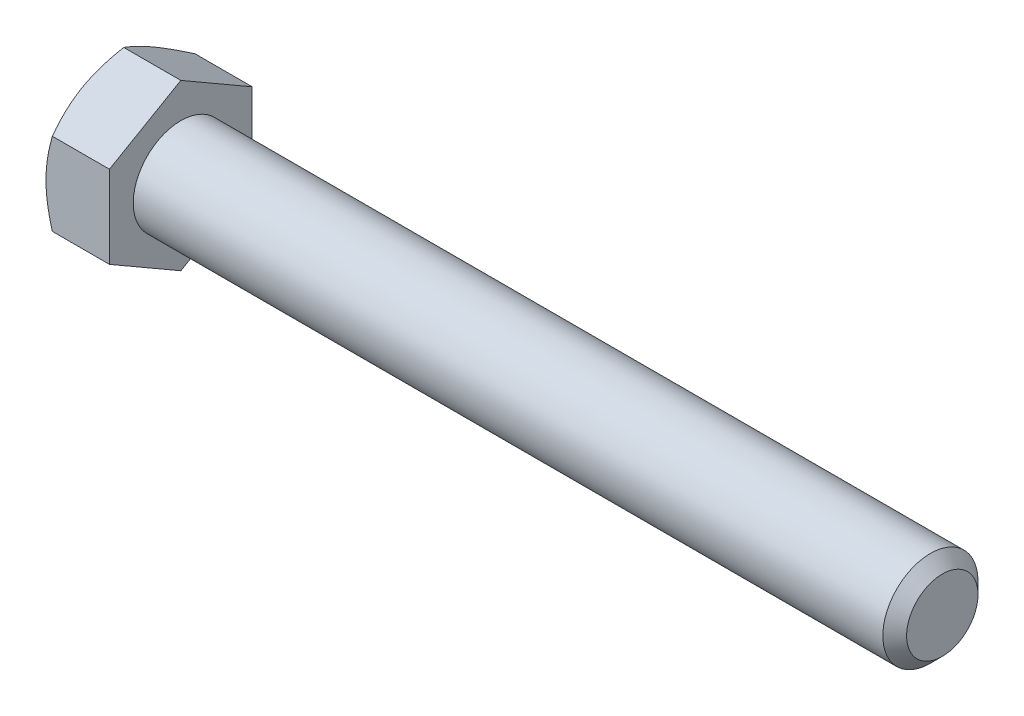
ISO-10303-21;
HEADER;
FILE_DESCRIPTION(('STEP AP214'),'2;1');
FILE_NAME('part.step','',(''),(''),'','','');
FILE_SCHEMA(('AUTOMOTIVE_DESIGN { 1 0 10303 214 1 1 1 1 }'));
ENDSEC;
DATA;
#1=APPLICATION_CONTEXT('core data for automotive mechanical design processes');
#2=APPLICATION_PROTOCOL_DEFINITION('international standard','automotive_design',2000,#1);
#3=PRODUCT_CONTEXT('',#1,'mechanical');
#4=PRODUCT('Part','Part','',(#3));
#5=PRODUCT_RELATED_PRODUCT_CATEGORY('part','',(#4));
#6=PRODUCT_DEFINITION_FORMATION('','',#4);
#7=PRODUCT_DEFINITION_CONTEXT('part definition',#1,'design');
#8=PRODUCT_DEFINITION('design','',#6,#7);
#9=PRODUCT_DEFINITION_SHAPE('','',#8);
#10=(LENGTH_UNIT() NAMED_UNIT(*) SI_UNIT(.MILLI.,.METRE.));
#11=(NAMED_UNIT(*) PLANE_ANGLE_UNIT() SI_UNIT($,.RADIAN.));
#12=(NAMED_UNIT(*) SI_UNIT($,.STERADIAN.) SOLID_ANGLE_UNIT());
#13=UNCERTAINTY_MEASURE_WITH_UNIT(LENGTH_MEASURE(1.E-05),#10,'distance_accuracy_value','');
#14=(GEOMETRIC_REPRESENTATION_CONTEXT(3) GLOBAL_UNCERTAINTY_ASSIGNED_CONTEXT((#13)) GLOBAL_UNIT_ASSIGNED_CONTEXT((#10,
#11,#12)) REPRESENTATION_CONTEXT('',''));
#15=CARTESIAN_POINT('',(0.,0.,0.));
#16=DIRECTION('',(0.,0.,1.));
#17=DIRECTION('',(1.,0.,0.));
#18=AXIS2_PLACEMENT_3D('',#15,#16,#17);
#19=CARTESIAN_POINT('',(-41.275,-4.12444598552339,7.14375));
#20=DIRECTION('',(0.,0.,-1.));
#21=DIRECTION('',(0.,1.,0.));
#22=AXIS2_PLACEMENT_3D('',#19,#20,#21);
#23=PLANE('',#22);
#24=CARTESIAN_POINT('',(-37.6837107291246,-11.2944476437763,7.14375000000001));
#25=CARTESIAN_POINT('',(-37.8368470181609,-10.9805232394077,7.14375000000001));
#26=CARTESIAN_POINT('',(-37.9885759416199,-10.6659008872169,7.14375000000001));
#27=CARTESIAN_POINT('',(-38.2884314864202,-10.0348898213436,7.14375000000001));
#28=CARTESIAN_POINT('',(-38.4365575792035,-9.71850085675994,7.14375000000001));
#29=CARTESIAN_POINT('',(-38.7291194579079,-9.08205743380556,7.14375000000001));
#30=CARTESIAN_POINT('',(-38.8735325502159,-8.76199250898872,7.14375000000001));
#31=CARTESIAN_POINT('',(-39.156729056574,-8.1193909617974,7.14375000000001));
#32=CARTESIAN_POINT('',(-39.2955127230965,-7.79685445104335,7.14375));
#33=CARTESIAN_POINT('',(-39.5706162676198,-7.13766604016633,7.14375));
#34=CARTESIAN_POINT('',(-39.706687685096,-6.80090989506933,7.14375));
#35=CARTESIAN_POINT('',(-39.9690446569592,-6.12353919008608,7.14375));
#36=CARTESIAN_POINT('',(-40.0953291440824,-5.78292421402389,7.14375));
#37=CARTESIAN_POINT('',(-40.3349543305284,-5.09786024749812,7.14375));
#38=CARTESIAN_POINT('',(-40.448319456363,-4.75341989048741,7.14375));
#39=CARTESIAN_POINT('',(-40.6586129161924,-4.05961513378647,7.14375));
#40=CARTESIAN_POINT('',(-40.7555462033468,-3.71025225244227,7.14375));
#41=CARTESIAN_POINT('',(-40.9279472656941,-3.00829070513183,7.14375));
#42=CARTESIAN_POINT('',(-41.0035368409942,-2.65572276057783,7.14375));
#43=CARTESIAN_POINT('',(-41.0977473017322,-2.12349462014205,7.14375));
#44=CARTESIAN_POINT('',(-41.1259563298876,-1.94551103747566,7.14375));
#45=CARTESIAN_POINT('',(-41.1754356720994,-1.58858869612631,7.14375));
#46=CARTESIAN_POINT('',(-41.1967066947931,-1.40965003689206,7.14375));
#47=CARTESIAN_POINT('',(-41.2316079167657,-1.05348730697548,7.14375));
#48=CARTESIAN_POINT('',(-41.2453382749067,-0.876273093939468,7.14375));
#49=CARTESIAN_POINT('',(-41.2652847155611,-0.521422092230765,7.14375));
#50=CARTESIAN_POINT('',(-41.2715009289899,-0.343785310974302,7.14375));
#51=CARTESIAN_POINT('',(-41.2762697532719,0.0115936241286041,7.14375));
#52=CARTESIAN_POINT('',(-41.2748223313712,0.18933577842216,7.14375));
#53=CARTESIAN_POINT('',(-41.2643014350504,0.544596189800663,7.14375));
#54=CARTESIAN_POINT('',(-41.2552276208028,0.722114436555401,7.14375));
#55=CARTESIAN_POINT('',(-41.2249195257372,1.14231672690702,7.14375));
#56=CARTESIAN_POINT('',(-41.2004249010896,1.38477115845963,7.14375));
#57=CARTESIAN_POINT('',(-41.1384979515929,1.86800860977947,7.14375));
#58=CARTESIAN_POINT('',(-41.1010640485552,2.1087914220052,7.14375));
#59=CARTESIAN_POINT('',(-40.9713280647363,2.82827840353934,7.14375));
#60=CARTESIAN_POINT('',(-40.8616106087773,3.30389106689052,7.14375));
#61=CARTESIAN_POINT('',(-40.6696836999771,4.01550298491582,7.14375));
#62=CARTESIAN_POINT('',(-40.6001876580378,4.2551445486297,7.14375));
#63=CARTESIAN_POINT('',(-40.4535636125596,4.73210450573968,7.14375));
#64=CARTESIAN_POINT('',(-40.3764355486346,4.96942288073788,7.14375));
#65=CARTESIAN_POINT('',(-40.2158189394422,5.44180614696491,7.14375));
#66=CARTESIAN_POINT('',(-40.1323321060842,5.67687162566704,7.14375));
#67=CARTESIAN_POINT('',(-39.9600214111274,6.14502503891485,7.14375));
#68=CARTESIAN_POINT('',(-39.8711976818887,6.37811302234082,7.14375));
#69=CARTESIAN_POINT('',(-39.620948189305,7.01633974983142,7.14375));
#70=CARTESIAN_POINT('',(-39.4549401417684,7.41968025406996,7.14375));
#71=CARTESIAN_POINT('',(-39.1128746766817,8.22209357946087,7.14375));
#72=CARTESIAN_POINT('',(-38.9368160495413,8.62116588004216,7.14375));
#73=CARTESIAN_POINT('',(-38.5770756305015,9.41604681837602,7.14375));
#74=CARTESIAN_POINT('',(-38.39339071307,9.81185403670852,7.14375));
#75=CARTESIAN_POINT('',(-38.0202597306568,10.600712317216,7.14375));
#76=CARTESIAN_POINT('',(-37.8308139221842,10.9937635011499,7.14375));
#77=CARTESIAN_POINT('',(-37.4471131080566,11.7783335003943,7.14375));
#78=CARTESIAN_POINT('',(-37.2528504856735,12.1698485826142,7.14375));
#79=CARTESIAN_POINT('',(-36.8607727676525,12.9510972653694,7.14375));
#80=CARTESIAN_POINT('',(-36.6629576395818,13.3408308495995,7.14375));
#81=CARTESIAN_POINT('',(-36.2645317877312,14.1187472681695,7.14375));
#82=CARTESIAN_POINT('',(-36.06392174218,14.5069304503015,7.14375));
#83=CARTESIAN_POINT('',(-35.6603913196838,15.2820948012496,7.14375));
#84=CARTESIAN_POINT('',(-35.4574709333829,15.6690759651901,7.14375));
#85=CARTESIAN_POINT('',(-34.8903473303459,16.7442233759679,7.14375));
#86=CARTESIAN_POINT('',(-34.5240917630888,17.4313067825052,7.14375));
#87=CARTESIAN_POINT('',(-33.787235673475,18.8031936251545,7.14375));
#88=CARTESIAN_POINT('',(-33.4166348627093,19.4879969060088,7.14375));
#89=CARTESIAN_POINT('',(-32.6735201430137,20.8534506388627,7.14375));
#90=CARTESIAN_POINT('',(-32.3010175066124,21.5341072316457,7.14374999999999));
#91=CARTESIAN_POINT('',(-31.5535551210306,22.8939962458748,7.14374999999999));
#92=CARTESIAN_POINT('',(-31.1785955803167,23.5732287818577,7.14374999999999));
#93=CARTESIAN_POINT('',(-30.802745898524,24.2519647910624,7.14374999999999));
#94=B_SPLINE_CURVE_WITH_KNOTS('',3,(#24,#25,#26,#27,#28,#29,#30,#31,#32,#33,#34,#35,#36,#37,#38,
#39,#40,#41,#42,#43,#44,#45,#46,#47,#48,#49,#50,#51,#52,#53,#54,#55,#56,#57,#58,#59,#60,#61,#62,
#63,#64,#65,#66,#67,#68,#69,#70,#71,#72,#73,#74,#75,#76,#77,#78,#79,#80,#81,#82,#83,#84,#85,#86,
#87,#88,#89,#90,#91,#92,#93),.UNSPECIFIED.,.F.,.F.,(4,2,2,2,2,2,2,2,2,2,2,2,2,2,2,2,2,2,2,2,2,2,
2,2,2,2,2,2,2,2,2,2,2,2,4),(0.,1.04786354483491,2.0958799018221,3.14924522983534,
4.20256326345294,5.29206939195641,6.38169416429139,7.46922336086985,8.55642415101154,
9.63728918942532,10.1777908946976,10.7182373766564,11.2513201674657,11.7843936705003,
12.3174694518642,12.8505689880335,13.5812265935341,14.3119733479507,15.7741561909275,
16.522632821703,17.2711153750577,18.0193971292228,18.7676603329377,20.0759569450815,
21.3844113444431,22.6934073945101,24.002345245369,25.3135047056319,26.6246761423151,
27.9355347616116,29.2463986911018,31.5821913644605,33.9181399602315,36.245893663836,
38.573452352829),.UNSPECIFIED.);
#95=CARTESIAN_POINT('',(-40.6369459855234,-4.12444598552339,7.14375));
#96=VERTEX_POINT('',#95);
#97=CARTESIAN_POINT('',(-41.275,0.,7.14375));
#98=VERTEX_POINT('',#97);
#99=EDGE_CURVE('E255',#96,#98,#94,.T.);
#100=ORIENTED_EDGE('',*,*,#99,.F.);
#101=DIRECTION('',(1.,0.,0.));
#102=VECTOR('',#101,1.);
#103=CARTESIAN_POINT('',(-41.275,-4.12444598552339,7.14375));
#104=LINE('',#103,#102);
#105=CARTESIAN_POINT('',(-34.925,-4.12444598552339,7.14375));
#106=VERTEX_POINT('',#105);
#107=EDGE_CURVE('E238',#96,#106,#104,.T.);
#108=ORIENTED_EDGE('',*,*,#107,.T.);
#109=DIRECTION('',(0.,1.,0.));
#110=VECTOR('',#109,1.);
#111=CARTESIAN_POINT('',(-34.925,-4.12444598552339,7.14375));
#112=LINE('',#111,#110);
#113=CARTESIAN_POINT('',(-34.925,4.12444598552339,7.14375));
#114=VERTEX_POINT('',#113);
#115=EDGE_CURVE('E253',#106,#114,#112,.T.);
#116=ORIENTED_EDGE('',*,*,#115,.T.);
#117=DIRECTION('',(1.,0.,0.));
#118=VECTOR('',#117,1.);
#119=CARTESIAN_POINT('',(-41.275,4.12444598552339,7.14375));
#120=LINE('',#119,#118);
#121=CARTESIAN_POINT('',(-40.6369459855234,4.12444598552339,7.14375));
#122=VERTEX_POINT('',#121);
#123=EDGE_CURVE('E229',#122,#114,#120,.T.);
#124=ORIENTED_EDGE('',*,*,#123,.F.);
#125=EDGE_CURVE('E109',#98,#122,#94,.T.);
#126=ORIENTED_EDGE('',*,*,#125,.F.);
#127=EDGE_LOOP('',(#100,#108,#116,#124,#126));
#128=FACE_BOUND('',#127,.T.);
#129=ADVANCED_FACE('F33',(#128),#23,.F.);
#130=CARTESIAN_POINT('',(-41.275,4.12444598552339,7.14375));
#131=DIRECTION('',(0.,-0.866025403784439,-0.5));
#132=DIRECTION('',(0.,0.5,-0.866025403784439));
#133=AXIS2_PLACEMENT_3D('',#130,#131,#132);
#134=PLANE('',#133);
#135=CARTESIAN_POINT('',(-40.6368793174569,4.12433051546955,7.14395));
#136=CARTESIAN_POINT('',(-40.68921396855,4.21499047493765,6.98692234398911));
#137=CARTESIAN_POINT('',(-40.7391734741408,4.30598845856222,6.82930921296504));
#138=CARTESIAN_POINT('',(-40.8336880324684,4.48872342670424,6.51280296382358));
#139=CARTESIAN_POINT('',(-40.8782407537979,4.58046071195489,6.35390932482102));
#140=CARTESIAN_POINT('',(-41.0029142378888,4.85714139103217,5.87468433118651));
#141=CARTESIAN_POINT('',(-41.0738270900442,5.04317693592539,5.55246131541769));
#142=CARTESIAN_POINT('',(-41.1569807614031,5.32157574305278,5.07026043670648));
#143=CARTESIAN_POINT('',(-41.1806688344435,5.4131071832703,4.91172333175978));
#144=CARTESIAN_POINT('',(-41.2203902768645,5.59658364372469,4.59393278025988));
#145=CARTESIAN_POINT('',(-41.2364243225755,5.6885286266948,4.43467939825459));
#146=CARTESIAN_POINT('',(-41.260429077991,5.87257827929426,4.11589604883692));
#147=CARTESIAN_POINT('',(-41.2684089385863,5.96468264833057,3.95636660206697));
#148=CARTESIAN_POINT('',(-41.2761427757077,6.14897138013525,3.63716915531883));
#149=CARTESIAN_POINT('',(-41.2758970063572,6.24115574034438,3.47750115977337));
#150=CARTESIAN_POINT('',(-41.2639170896088,6.49371006632156,3.04006423550959));
#151=CARTESIAN_POINT('',(-41.243806378855,6.65399735752975,2.76243850332942));
#152=CARTESIAN_POINT('',(-41.180035493257,6.97350732659354,2.20903100338617));
#153=CARTESIAN_POINT('',(-41.1363535225342,7.13272888080875,1.93325118182535));
#154=CARTESIAN_POINT('',(-41.0271614095432,7.45288184700059,1.37872997818721));
#155=CARTESIAN_POINT('',(-40.9611886381118,7.61377286233254,1.10005856515092));
#156=CARTESIAN_POINT('',(-40.8114571178419,7.93315557291967,0.546871483354954));
#157=CARTESIAN_POINT('',(-40.7277335396244,8.09165135831552,0.272348730263808));
#158=CARTESIAN_POINT('',(-40.6368793174569,8.24900744110062,-0.00020000000000243));
#159=B_SPLINE_CURVE_WITH_KNOTS('',3,(#135,#136,#137,#138,#139,#140,#141,#142,#143,#144,#145,
#146,#147,#148,#149,#150,#151,#152,#153,#154,#155,#156,#157,#158),.UNSPECIFIED.,.F.,.F.,(4,2,2,
2,2,2,2,2,2,2,2,4),(0.,0.566119481838008,1.13248221371019,2.26756105798161,2.82119915823018,
3.37478832846408,3.92774781910559,4.48069022658465,5.44329448766885,6.4067903790172,
7.39165514483024,8.37458648302854),.UNSPECIFIED.);
#160=CARTESIAN_POINT('',(-41.275,6.18666897828508,3.571875));
#161=VERTEX_POINT('',#160);
#162=EDGE_CURVE('E105',#122,#161,#159,.T.);
#163=ORIENTED_EDGE('',*,*,#162,.F.);
#164=ORIENTED_EDGE('',*,*,#123,.T.);
#165=DIRECTION('',(0.,0.5,-0.866025403784439));
#166=VECTOR('',#165,1.);
#167=CARTESIAN_POINT('',(-34.925,4.12444598552339,7.14375));
#168=LINE('',#167,#166);
#169=CARTESIAN_POINT('',(-34.925,8.24889197104678,0.));
#170=VERTEX_POINT('',#169);
#171=EDGE_CURVE('E252',#114,#170,#168,.T.);
#172=ORIENTED_EDGE('',*,*,#171,.T.);
#173=DIRECTION('',(1.,0.,0.));
#174=VECTOR('',#173,1.);
#175=CARTESIAN_POINT('',(-41.275,8.24889197104678,0.));
#176=LINE('',#175,#174);
#177=CARTESIAN_POINT('',(-40.6369459855234,8.24889197104678,0.));
#178=VERTEX_POINT('',#177);
#179=EDGE_CURVE('E128',#178,#170,#176,.T.);
#180=ORIENTED_EDGE('',*,*,#179,.F.);
#181=EDGE_CURVE('E113',#161,#178,#159,.T.);
#182=ORIENTED_EDGE('',*,*,#181,.F.);
#183=EDGE_LOOP('',(#163,#164,#172,#180,#182));
#184=FACE_BOUND('',#183,.T.);
#185=ADVANCED_FACE('F126',(#184),#134,.F.);
#186=CARTESIAN_POINT('',(-41.275,8.24889197104678,0.));
#187=DIRECTION('',(0.,-0.866025403784439,0.5));
#188=DIRECTION('',(0.,-0.5,-0.866025403784439));
#189=AXIS2_PLACEMENT_3D('',#186,#187,#188);
#190=PLANE('',#189);
#191=CARTESIAN_POINT('',(-40.6368793174569,8.24900744110062,0.000199999999998423));
#192=CARTESIAN_POINT('',(-40.68921396855,8.15834748163251,-0.156827656010894));
#193=CARTESIAN_POINT('',(-40.7391734741408,8.06734949800795,-0.314440787034966));
#194=CARTESIAN_POINT('',(-40.8336880324684,7.88461452986593,-0.630947036176425));
#195=CARTESIAN_POINT('',(-40.8782407537979,7.79287724461528,-0.789840675178983));
#196=CARTESIAN_POINT('',(-41.0029142378888,7.516196565538,-1.26906566881349));
#197=CARTESIAN_POINT('',(-41.0738270900442,7.33016102064478,-1.59128868458231));
#198=CARTESIAN_POINT('',(-41.1569807614031,7.05176221351739,-2.07348956329352));
#199=CARTESIAN_POINT('',(-41.1806688344435,6.96023077329986,-2.23202666824022));
#200=CARTESIAN_POINT('',(-41.2203902768645,6.77675431284548,-2.54981721974012));
#201=CARTESIAN_POINT('',(-41.2364243225755,6.68480932987537,-2.70907060174541));
#202=CARTESIAN_POINT('',(-41.260429077991,6.50075967727591,-3.02785395116308));
#203=CARTESIAN_POINT('',(-41.2684089385863,6.4086553082396,-3.18738339793304));
#204=CARTESIAN_POINT('',(-41.2761427757077,6.22436657643492,-3.50658084468118));
#205=CARTESIAN_POINT('',(-41.2758970063572,6.13218221622578,-3.66624884022663));
#206=CARTESIAN_POINT('',(-41.2639170896088,5.87962789024861,-4.10368576449041));
#207=CARTESIAN_POINT('',(-41.2438063788549,5.71934059904042,-4.38131149667058));
#208=CARTESIAN_POINT('',(-41.180035493257,5.39983062997663,-4.93471899661383));
#209=CARTESIAN_POINT('',(-41.1363535225342,5.24060907576142,-5.21049881817465));
#210=CARTESIAN_POINT('',(-41.0271614095432,4.92045610956959,-5.76502002181279));
#211=CARTESIAN_POINT('',(-40.9611886381118,4.75956509423763,-6.04369143484908));
#212=CARTESIAN_POINT('',(-40.8114571178419,4.44018238365051,-6.59687851664505));
#213=CARTESIAN_POINT('',(-40.7277335396243,4.28168659825466,-6.87140126973619));
#214=CARTESIAN_POINT('',(-40.6368793174569,4.12433051546956,-7.14395));
#215=B_SPLINE_CURVE_WITH_KNOTS('',3,(#191,#192,#193,#194,#195,#196,#197,#198,#199,#200,#201,
#202,#203,#204,#205,#206,#207,#208,#209,#210,#211,#212,#213,#214),.UNSPECIFIED.,.F.,.F.,(4,2,2,
2,2,2,2,2,2,2,2,4),(0.,0.566119481838006,1.13248221371019,2.2675610579816,2.82119915823018,
3.37478832846408,3.92774781910559,4.48069022658465,5.44329448766885,6.4067903790172,
7.39165514483023,8.37458648302854),.UNSPECIFIED.);
#216=CARTESIAN_POINT('',(-41.275,6.18666897828508,-3.571875));
#217=VERTEX_POINT('',#216);
#218=EDGE_CURVE('E118',#178,#217,#215,.T.);
#219=ORIENTED_EDGE('',*,*,#218,.F.);
#220=ORIENTED_EDGE('',*,*,#179,.T.);
#221=DIRECTION('',(0.,-0.5,-0.866025403784439));
#222=VECTOR('',#221,1.);
#223=CARTESIAN_POINT('',(-34.925,8.24889197104678,0.));
#224=LINE('',#223,#222);
#225=CARTESIAN_POINT('',(-34.925,4.12444598552339,-7.14375));
#226=VERTEX_POINT('',#225);
#227=EDGE_CURVE('E249',#170,#226,#224,.T.);
#228=ORIENTED_EDGE('',*,*,#227,.T.);
#229=DIRECTION('',(1.,0.,0.));
#230=VECTOR('',#229,1.);
#231=CARTESIAN_POINT('',(-41.275,4.12444598552339,-7.14375));
#232=LINE('',#231,#230);
#233=CARTESIAN_POINT('',(-40.6369459855234,4.12444598552339,-7.14375));
#234=VERTEX_POINT('',#233);
#235=EDGE_CURVE('E232',#234,#226,#232,.T.);
#236=ORIENTED_EDGE('',*,*,#235,.F.);
#237=EDGE_CURVE('E129',#217,#234,#215,.T.);
#238=ORIENTED_EDGE('',*,*,#237,.F.);
#239=EDGE_LOOP('',(#219,#220,#228,#236,#238));
#240=FACE_BOUND('',#239,.T.);
#241=ADVANCED_FACE('F189',(#240),#190,.F.);
#242=CARTESIAN_POINT('',(-41.275,4.12444598552339,-7.14375));
#243=DIRECTION('',(0.,0.,1.));
#244=DIRECTION('',(0.,-1.,0.));
#245=AXIS2_PLACEMENT_3D('',#242,#243,#244);
#246=PLANE('',#245);
#247=CARTESIAN_POINT('',(-37.683710735141,-11.2944476314463,-7.14375));
#248=CARTESIAN_POINT('',(-37.8368470239269,-10.980523227493,-7.14375));
#249=CARTESIAN_POINT('',(-37.9885759471357,-10.6659008757179,-7.14375));
#250=CARTESIAN_POINT('',(-38.2884314914368,-10.0348898106771,-7.14375));
#251=CARTESIAN_POINT('',(-38.436557583971,-9.71850084651029,-7.14375));
#252=CARTESIAN_POINT('',(-38.7291194621773,-9.08205742439585,-7.14375));
#253=CARTESIAN_POINT('',(-38.8735325542362,-8.7619925000021,-7.14375));
#254=CARTESIAN_POINT('',(-39.1567290601003,-8.11939095365976,-7.14375));
#255=CARTESIAN_POINT('',(-39.2955127263778,-7.7968544433316,-7.14375));
#256=CARTESIAN_POINT('',(-39.5706162704032,-7.13766603334091,-7.14375));
#257=CARTESIAN_POINT('',(-39.7066876876271,-6.80090988870464,-7.14375));
#258=CARTESIAN_POINT('',(-39.9690446589987,-6.12353918465013,-7.14375));
#259=CARTESIAN_POINT('',(-40.0953291458829,-5.78292420905595,-7.14375));
#260=CARTESIAN_POINT('',(-40.3349543318731,-5.09786024347484,-7.14375));
#261=CARTESIAN_POINT('',(-40.448319457491,-4.75341988694075,-7.14375));
#262=CARTESIAN_POINT('',(-40.6586129169216,-4.05961513120583,-7.14375));
#263=CARTESIAN_POINT('',(-40.755546203894,-3.71025225035102,-7.14375));
#264=CARTESIAN_POINT('',(-40.9279472658733,-3.00829070426652,-7.14375));
#265=CARTESIAN_POINT('',(-41.0035368410009,-2.65572276045244,-7.14375));
#266=CARTESIAN_POINT('',(-41.0977473015633,-2.12349462113998,-7.14375));
#267=CARTESIAN_POINT('',(-41.1259563296739,-1.94551103885013,-7.14375));
#268=CARTESIAN_POINT('',(-41.1754356718271,-1.5885886982572,-7.14375));
#269=CARTESIAN_POINT('',(-41.1967066945069,-1.40965003940282,-7.14375));
#270=CARTESIAN_POINT('',(-41.2316079164856,-1.05348731023808,-7.14375));
#271=CARTESIAN_POINT('',(-41.2453382746457,-0.876273097573986,-7.14375));
#272=CARTESIAN_POINT('',(-41.2652847153717,-0.521422096608587,-7.14375));
#273=CARTESIAN_POINT('',(-41.2715009288527,-0.34378531572351,-7.14375));
#274=CARTESIAN_POINT('',(-41.2762697532717,0.0115936186392656,-7.14375));
#275=CARTESIAN_POINT('',(-41.2748223314557,0.189335772564077,-7.14375));
#276=CARTESIAN_POINT('',(-41.2643014353346,0.544596183209796,-7.14375));
#277=CARTESIAN_POINT('',(-41.255227621202,0.722114429600494,-7.14375));
#278=CARTESIAN_POINT('',(-41.224919526419,1.14231671939732,-7.14375));
#279=CARTESIAN_POINT('',(-41.2004249019336,1.3847711507607,-7.14375));
#280=CARTESIAN_POINT('',(-41.1384979527697,1.8680086017109,-7.14375));
#281=CARTESIAN_POINT('',(-41.1010640499027,2.1087914137562,-7.14375));
#282=CARTESIAN_POINT('',(-40.9713280665993,2.8282783947592,-7.14375));
#283=CARTESIAN_POINT('',(-40.8616106109884,3.30389105777069,-7.14375));
#284=CARTESIAN_POINT('',(-40.6696837027012,4.01550297528799,-7.14375));
#285=CARTESIAN_POINT('',(-40.6001876609342,4.25514453882878,-7.14375));
#286=CARTESIAN_POINT('',(-40.4535636157949,4.7321044955946,-7.14375));
#287=CARTESIAN_POINT('',(-40.3764355520365,4.96942287042174,-7.14375));
#288=CARTESIAN_POINT('',(-40.2158189431713,5.44180613630801,-7.14375));
#289=CARTESIAN_POINT('',(-40.1323321099739,5.67687161484044,-7.14375));
#290=CARTESIAN_POINT('',(-39.9600214153323,6.14502502774882,-7.14375));
#291=CARTESIAN_POINT('',(-39.8711976862483,6.37811301100507,-7.14375));
#292=CARTESIAN_POINT('',(-39.6209481939352,7.01633973840397,-7.14375));
#293=CARTESIAN_POINT('',(-39.4549401464965,7.41968024271512,-7.14375));
#294=CARTESIAN_POINT('',(-39.1128746815765,8.22209356824176,-7.14375));
#295=CARTESIAN_POINT('',(-38.9368160545049,8.62116586888615,-7.14375));
#296=CARTESIAN_POINT('',(-38.5770756355816,9.41604680733946,-7.14375));
#297=CARTESIAN_POINT('',(-38.3933907181979,9.81185402572831,-7.14375));
#298=CARTESIAN_POINT('',(-38.0202597358657,10.6007123063424,-7.14375));
#299=CARTESIAN_POINT('',(-37.8308139274263,10.9937634903265,-7.14375));
#300=CARTESIAN_POINT('',(-37.4471131133527,11.7783334896699,-7.14375));
#301=CARTESIAN_POINT('',(-37.2528504909905,12.1698485719387,-7.14375));
#302=CARTESIAN_POINT('',(-36.8607727730034,12.951097254788,-7.14375));
#303=CARTESIAN_POINT('',(-36.6629576449456,13.3408308390634,-7.14375));
#304=CARTESIAN_POINT('',(-36.2645317931152,14.1187472577206,-7.14375));
#305=CARTESIAN_POINT('',(-36.0639217475714,14.5069304398945,-7.14375));
#306=CARTESIAN_POINT('',(-35.6603913250851,15.2820947909242,-7.14375));
#307=CARTESIAN_POINT('',(-35.457470938787,15.6690759549044,-7.14375));
#308=CARTESIAN_POINT('',(-34.8903473357884,16.744223365723,-7.14375));
#309=CARTESIAN_POINT('',(-34.5240917685636,17.4313067722598,-7.14375));
#310=CARTESIAN_POINT('',(-33.787235679008,18.8031936149052,-7.14375));
#311=CARTESIAN_POINT('',(-33.4166348682681,19.487996895756,-7.14375));
#312=CARTESIAN_POINT('',(-32.673520148626,20.853450628589,-7.14375));
#313=CARTESIAN_POINT('',(-32.3010175122525,21.5341072213546,-7.14375));
#314=CARTESIAN_POINT('',(-31.5535551267233,22.8939962355469,-7.14375));
#315=CARTESIAN_POINT('',(-31.1785955860342,23.5732287715106,-7.14375));
#316=CARTESIAN_POINT('',(-30.8027459042655,24.2519647806954,-7.14375));
#317=B_SPLINE_CURVE_WITH_KNOTS('',3,(#247,#248,#249,#250,#251,#252,#253,#254,#255,#256,#257,
#258,#259,#260,#261,#262,#263,#264,#265,#266,#267,#268,#269,#270,#271,#272,#273,#274,#275,#276,
#277,#278,#279,#280,#281,#282,#283,#284,#285,#286,#287,#288,#289,#290,#291,#292,#293,#294,#295,
#296,#297,#298,#299,#300,#301,#302,#303,#304,#305,#306,#307,#308,#309,#310,#311,#312,#313,#314,
#315,#316),.UNSPECIFIED.,.F.,.F.,(4,2,2,2,2,2,2,2,2,2,2,2,2,2,2,2,2,2,2,2,2,2,2,2,2,2,2,2,2,2,2,
2,2,2,4),(0.,1.04786354338569,2.09587989892346,3.14924522547247,4.20256325762595,
5.2920693845644,6.38169415533385,7.46922335035172,8.55642413893401,9.63728917507435,
10.1777908792107,10.7182373600339,11.2513201497363,11.784393651664,12.3174694319207,
12.8505689669825,13.5812265718698,14.3119733256731,15.7741561674203,16.5226327975529,
17.2711153502647,18.0193971037887,18.7676603068624,20.0759569190947,21.3844113185457,
22.6934073687054,24.0023452196567,25.3135046800229,26.6246761168095,27.9355347362076,
29.2463986657995,31.5821913391112,33.9181399348361,36.2458936383548,38.573452327261),.UNSPECIFIED.);
#318=CARTESIAN_POINT('',(-41.275,0.,-7.14375));
#319=VERTEX_POINT('',#318);
#320=EDGE_CURVE('E183',#234,#319,#317,.F.);
#321=ORIENTED_EDGE('',*,*,#320,.F.);
#322=ORIENTED_EDGE('',*,*,#235,.T.);
#323=DIRECTION('',(0.,-1.,0.));
#324=VECTOR('',#323,1.);
#325=CARTESIAN_POINT('',(-34.925,4.12444598552339,-7.14375));
#326=LINE('',#325,#324);
#327=CARTESIAN_POINT('',(-34.925,-4.12444598552339,-7.14375));
#328=VERTEX_POINT('',#327);
#329=EDGE_CURVE('E246',#226,#328,#326,.T.);
#330=ORIENTED_EDGE('',*,*,#329,.T.);
#331=DIRECTION('',(1.,0.,0.));
#332=VECTOR('',#331,1.);
#333=CARTESIAN_POINT('',(-41.275,-4.12444598552339,-7.14375));
#334=LINE('',#333,#332);
#335=CARTESIAN_POINT('',(-40.6369459855234,-4.12444598552339,-7.14375));
#336=VERTEX_POINT('',#335);
#337=EDGE_CURVE('E234',#336,#328,#334,.T.);
#338=ORIENTED_EDGE('',*,*,#337,.F.);
#339=EDGE_CURVE('E177',#319,#336,#317,.F.);
#340=ORIENTED_EDGE('',*,*,#339,.F.);
#341=EDGE_LOOP('',(#321,#322,#330,#338,#340));
#342=FACE_BOUND('',#341,.T.);
#343=ADVANCED_FACE('F185',(#342),#246,.F.);
#344=CARTESIAN_POINT('',(-41.275,-4.12444598552339,-7.14375));
#345=DIRECTION('',(0.,0.866025403784439,0.5));
#346=DIRECTION('',(0.,-0.5,0.866025403784439));
#347=AXIS2_PLACEMENT_3D('',#344,#345,#346);
#348=PLANE('',#347);
#349=CARTESIAN_POINT('',(-40.6368793174569,-4.12433051546955,-7.14395));
#350=CARTESIAN_POINT('',(-40.68921396855,-4.21499047493766,-6.9869223439891));
#351=CARTESIAN_POINT('',(-40.7391734741408,-4.30598845856222,-6.82930921296503));
#352=CARTESIAN_POINT('',(-40.8336880324684,-4.48872342670424,-6.51280296382357));
#353=CARTESIAN_POINT('',(-40.8782407537979,-4.58046071195489,-6.35390932482101));
#354=CARTESIAN_POINT('',(-41.0029142378888,-4.85714139103217,-5.8746843311865));
#355=CARTESIAN_POINT('',(-41.0738270900442,-5.04317693592539,-5.55246131541769));
#356=CARTESIAN_POINT('',(-41.1569807614031,-5.32157574305278,-5.07026043670648));
#357=CARTESIAN_POINT('',(-41.1806688344435,-5.4131071832703,-4.91172333175978));
#358=CARTESIAN_POINT('',(-41.2203902768645,-5.59658364372469,-4.59393278025988));
#359=CARTESIAN_POINT('',(-41.2364243225755,-5.6885286266948,-4.43467939825459));
#360=CARTESIAN_POINT('',(-41.260429077991,-5.87257827929426,-4.11589604883692));
#361=CARTESIAN_POINT('',(-41.2684089385863,-5.96468264833057,-3.95636660206697));
#362=CARTESIAN_POINT('',(-41.2761427757077,-6.14897138013525,-3.63716915531883));
#363=CARTESIAN_POINT('',(-41.2758970063572,-6.24115574034438,-3.47750115977337));
#364=CARTESIAN_POINT('',(-41.2639170896088,-6.49371006632156,-3.04006423550959));
#365=CARTESIAN_POINT('',(-41.243806378855,-6.65399735752975,-2.76243850332942));
#366=CARTESIAN_POINT('',(-41.180035493257,-6.97350732659354,-2.20903100338617));
#367=CARTESIAN_POINT('',(-41.1363535225342,-7.13272888080875,-1.93325118182535));
#368=CARTESIAN_POINT('',(-41.0271614095432,-7.45288184700058,-1.37872997818721));
#369=CARTESIAN_POINT('',(-40.9611886381118,-7.61377286233254,-1.10005856515092));
#370=CARTESIAN_POINT('',(-40.8114571178419,-7.93315557291966,-0.546871483354957));
#371=CARTESIAN_POINT('',(-40.7277335396244,-8.09165135831551,-0.272348730263812));
#372=CARTESIAN_POINT('',(-40.6368793174569,-8.24900744110061,0.000200000000000276));
#373=B_SPLINE_CURVE_WITH_KNOTS('',3,(#349,#350,#351,#352,#353,#354,#355,#356,#357,#358,#359,
#360,#361,#362,#363,#364,#365,#366,#367,#368,#369,#370,#371,#372),.UNSPECIFIED.,.F.,.F.,(4,2,2,
2,2,2,2,2,2,2,2,4),(0.,0.566119481838005,1.13248221371019,2.2675610579816,2.82119915823017,
3.37478832846408,3.92774781910558,4.48069022658465,5.44329448766884,6.40679037901719,
7.39165514483023,8.37458648302853),.UNSPECIFIED.);
#374=CARTESIAN_POINT('',(-41.275,-6.18666897828508,-3.571875));
#375=VERTEX_POINT('',#374);
#376=EDGE_CURVE('E184',#336,#375,#373,.T.);
#377=ORIENTED_EDGE('',*,*,#376,.F.);
#378=ORIENTED_EDGE('',*,*,#337,.T.);
#379=DIRECTION('',(0.,-0.5,0.866025403784439));
#380=VECTOR('',#379,1.);
#381=CARTESIAN_POINT('',(-34.925,-4.12444598552339,-7.14375));
#382=LINE('',#381,#380);
#383=CARTESIAN_POINT('',(-34.925,-8.24889197104678,0.));
#384=VERTEX_POINT('',#383);
#385=EDGE_CURVE('E243',#328,#384,#382,.T.);
#386=ORIENTED_EDGE('',*,*,#385,.T.);
#387=DIRECTION('',(1.,0.,0.));
#388=VECTOR('',#387,1.);
#389=CARTESIAN_POINT('',(-41.275,-8.24889197104678,0.));
#390=LINE('',#389,#388);
#391=CARTESIAN_POINT('',(-40.6369459855234,-8.24889197104678,0.));
#392=VERTEX_POINT('',#391);
#393=EDGE_CURVE('E236',#392,#384,#390,.T.);
#394=ORIENTED_EDGE('',*,*,#393,.F.);
#395=EDGE_CURVE('E171',#375,#392,#373,.T.);
#396=ORIENTED_EDGE('',*,*,#395,.F.);
#397=EDGE_LOOP('',(#377,#378,#386,#394,#396));
#398=FACE_BOUND('',#397,.T.);
#399=ADVANCED_FACE('F188',(#398),#348,.F.);
#400=CARTESIAN_POINT('',(-41.275,-8.24889197104678,0.));
#401=DIRECTION('',(0.,0.866025403784439,-0.5));
#402=DIRECTION('',(0.,0.5,0.866025403784439));
#403=AXIS2_PLACEMENT_3D('',#400,#401,#402);
#404=PLANE('',#403);
#405=CARTESIAN_POINT('',(-40.6368793174569,-8.24900744110061,-0.000200000000000231));
#406=CARTESIAN_POINT('',(-40.68921396855,-8.15834748163251,0.156827656010892));
#407=CARTESIAN_POINT('',(-40.7391734741408,-8.06734949800794,0.314440787034964));
#408=CARTESIAN_POINT('',(-40.8336880324684,-7.88461452986592,0.630947036176423));
#409=CARTESIAN_POINT('',(-40.8782407537979,-7.79287724461528,0.789840675178982));
#410=CARTESIAN_POINT('',(-41.0029142378888,-7.51619656553799,1.26906566881349));
#411=CARTESIAN_POINT('',(-41.0738270900442,-7.33016102064478,1.59128868458231));
#412=CARTESIAN_POINT('',(-41.1569807614031,-7.05176221351738,2.07348956329352));
#413=CARTESIAN_POINT('',(-41.1806688344435,-6.96023077329986,2.23202666824022));
#414=CARTESIAN_POINT('',(-41.2203902768645,-6.77675431284548,2.54981721974012));
#415=CARTESIAN_POINT('',(-41.2364243225755,-6.68480932987537,2.7090706017454));
#416=CARTESIAN_POINT('',(-41.260429077991,-6.5007596772759,3.02785395116308));
#417=CARTESIAN_POINT('',(-41.2684089385863,-6.4086553082396,3.18738339793303));
#418=CARTESIAN_POINT('',(-41.2761427757077,-6.22436657643492,3.50658084468117));
#419=CARTESIAN_POINT('',(-41.2758970063572,-6.13218221622578,3.66624884022662));
#420=CARTESIAN_POINT('',(-41.2639170896088,-5.8796278902486,4.10368576449041));
#421=CARTESIAN_POINT('',(-41.243806378855,-5.71934059904042,4.38131149667058));
#422=CARTESIAN_POINT('',(-41.180035493257,-5.39983062997662,4.93471899661383));
#423=CARTESIAN_POINT('',(-41.1363535225342,-5.24060907576141,5.21049881817465));
#424=CARTESIAN_POINT('',(-41.0271614095432,-4.92045610956958,5.76502002181279));
#425=CARTESIAN_POINT('',(-40.9611886381118,-4.75956509423762,6.04369143484908));
#426=CARTESIAN_POINT('',(-40.8114571178419,-4.4401823836505,6.59687851664505));
#427=CARTESIAN_POINT('',(-40.7277335396244,-4.28168659825465,6.87140126973619));
#428=CARTESIAN_POINT('',(-40.6368793174569,-4.12433051546955,7.14395));
#429=B_SPLINE_CURVE_WITH_KNOTS('',3,(#405,#406,#407,#408,#409,#410,#411,#412,#413,#414,#415,
#416,#417,#418,#419,#420,#421,#422,#423,#424,#425,#426,#427,#428),.UNSPECIFIED.,.F.,.F.,(4,2,2,
2,2,2,2,2,2,2,2,4),(0.,0.566119481838004,1.13248221371019,2.2675610579816,2.82119915823017,
3.37478832846408,3.92774781910558,4.48069022658465,5.44329448766885,6.4067903790172,
7.39165514483024,8.37458648302854),.UNSPECIFIED.);
#430=CARTESIAN_POINT('',(-41.275,-6.18666897828508,3.571875));
#431=VERTEX_POINT('',#430);
#432=EDGE_CURVE('E281',#392,#431,#429,.T.);
#433=ORIENTED_EDGE('',*,*,#432,.F.);
#434=ORIENTED_EDGE('',*,*,#393,.T.);
#435=DIRECTION('',(0.,0.5,0.866025403784439));
#436=VECTOR('',#435,1.);
#437=CARTESIAN_POINT('',(-34.925,-8.24889197104678,0.));
#438=LINE('',#437,#436);
#439=EDGE_CURVE('E240',#384,#106,#438,.T.);
#440=ORIENTED_EDGE('',*,*,#439,.T.);
#441=ORIENTED_EDGE('',*,*,#107,.F.);
#442=EDGE_CURVE('E123',#431,#96,#429,.T.);
#443=ORIENTED_EDGE('',*,*,#442,.F.);
#444=EDGE_LOOP('',(#433,#434,#440,#441,#443));
#445=FACE_BOUND('',#444,.T.);
#446=ADVANCED_FACE('F210',(#445),#404,.F.);
#447=CARTESIAN_POINT('',(-34.925,0.,0.));
#448=DIRECTION('',(1.,0.,0.));
#449=DIRECTION('',(0.,0.,-1.));
#450=AXIS2_PLACEMENT_3D('',#447,#448,#449);
#451=CYLINDRICAL_SURFACE('',#450,4.7625);
#452=CARTESIAN_POINT('',(-34.925,0.,0.));
#453=DIRECTION('',(-1.,0.,0.));
#454=DIRECTION('',(0.,0.,1.));
#455=AXIS2_PLACEMENT_3D('',#452,#453,#454);
#456=CIRCLE('',#455,4.7625);
#457=CARTESIAN_POINT('',(-34.925,0.,4.7625));
#458=VERTEX_POINT('',#457);
#459=EDGE_CURVE('E219',#458,#458,#456,.F.);
#460=ORIENTED_EDGE('',*,*,#459,.T.);
#461=EDGE_LOOP('',(#460));
#462=FACE_BOUND('',#461,.T.);
#463=CARTESIAN_POINT('',(40.084375,0.,0.));
#464=DIRECTION('',(1.,0.,0.));
#465=DIRECTION('',(0.,0.,-1.));
#466=AXIS2_PLACEMENT_3D('',#463,#464,#465);
#467=CIRCLE('',#466,4.7625);
#468=CARTESIAN_POINT('',(40.084375,0.,-4.7625));
#469=VERTEX_POINT('',#468);
#470=EDGE_CURVE('E222',#469,#469,#467,.F.);
#471=ORIENTED_EDGE('',*,*,#470,.T.);
#472=EDGE_LOOP('',(#471));
#473=FACE_BOUND('',#472,.T.);
#474=ADVANCED_FACE('F207',(#462,#473),#451,.T.);
#475=CARTESIAN_POINT('',(41.275,0.,0.));
#476=DIRECTION('',(1.,0.,0.));
#477=DIRECTION('',(0.,0.,-1.));
#478=AXIS2_PLACEMENT_3D('',#475,#476,#477);
#479=PLANE('',#478);
#480=CARTESIAN_POINT('',(41.275,0.,0.));
#481=DIRECTION('',(1.,0.,0.));
#482=DIRECTION('',(0.,0.,-1.));
#483=AXIS2_PLACEMENT_3D('',#480,#481,#482);
#484=CIRCLE('',#483,3.571875);
#485=CARTESIAN_POINT('',(41.275,0.,-3.571875));
#486=VERTEX_POINT('',#485);
#487=EDGE_CURVE('E224',#486,#486,#484,.T.);
#488=ORIENTED_EDGE('',*,*,#487,.T.);
#489=EDGE_LOOP('',(#488));
#490=FACE_BOUND('',#489,.T.);
#491=ADVANCED_FACE('F205',(#490),#479,.T.);
#492=CARTESIAN_POINT('',(41.275,0.,0.));
#493=DIRECTION('',(-1.,0.,0.));
#494=DIRECTION('',(0.,0.,1.));
#495=AXIS2_PLACEMENT_3D('',#492,#493,#494);
#496=CONICAL_SURFACE('',#495,3.571875,0.78539816339745);
#497=ORIENTED_EDGE('',*,*,#470,.F.);
#498=EDGE_LOOP('',(#497));
#499=FACE_BOUND('',#498,.T.);
#500=ORIENTED_EDGE('',*,*,#487,.F.);
#501=EDGE_LOOP('',(#500));
#502=FACE_BOUND('',#501,.T.);
#503=ADVANCED_FACE('F35',(#499,#502),#496,.T.);
#504=CARTESIAN_POINT('',(-34.925,4.12444598552339,7.14375));
#505=DIRECTION('',(-1.,0.,0.));
#506=DIRECTION('',(0.,0.,1.));
#507=AXIS2_PLACEMENT_3D('',#504,#505,#506);
#508=PLANE('',#507);
#509=ORIENTED_EDGE('',*,*,#459,.F.);
#510=EDGE_LOOP('',(#509));
#511=FACE_BOUND('',#510,.T.);
#512=ORIENTED_EDGE('',*,*,#115,.F.);
#513=ORIENTED_EDGE('',*,*,#439,.F.);
#514=ORIENTED_EDGE('',*,*,#385,.F.);
#515=ORIENTED_EDGE('',*,*,#329,.F.);
#516=ORIENTED_EDGE('',*,*,#227,.F.);
#517=ORIENTED_EDGE('',*,*,#171,.F.);
#518=EDGE_LOOP('',(#512,#513,#514,#515,#516,#517));
#519=FACE_BOUND('',#518,.T.);
#520=ADVANCED_FACE('F156',(#511,#519),#508,.F.);
#521=CARTESIAN_POINT('',(-41.275,0.,0.));
#522=DIRECTION('',(1.,0.,0.));
#523=DIRECTION('',(0.,0.,1.));
#524=AXIS2_PLACEMENT_3D('',#521,#522,#523);
#525=CONICAL_SURFACE('',#524,7.14375,1.0471975511966);
#526=ORIENTED_EDGE('',*,*,#99,.T.);
#527=CARTESIAN_POINT('',(-41.275,0.,0.));
#528=DIRECTION('',(-1.,0.,0.));
#529=DIRECTION('',(0.,0.,1.));
#530=AXIS2_PLACEMENT_3D('',#527,#528,#529);
#531=CIRCLE('',#530,7.14375);
#532=EDGE_CURVE('E37',#431,#98,#531,.T.);
#533=ORIENTED_EDGE('',*,*,#532,.F.);
#534=ORIENTED_EDGE('',*,*,#442,.T.);
#535=EDGE_LOOP('',(#526,#533,#534));
#536=FACE_BOUND('',#535,.T.);
#537=ADVANCED_FACE('F151',(#536),#525,.T.);
#538=ORIENTED_EDGE('',*,*,#395,.T.);
#539=ORIENTED_EDGE('',*,*,#432,.T.);
#540=EDGE_CURVE('E57',#375,#431,#531,.T.);
#541=ORIENTED_EDGE('',*,*,#540,.F.);
#542=EDGE_LOOP('',(#538,#539,#541));
#543=FACE_BOUND('',#542,.T.);
#544=ADVANCED_FACE('F155',(#543),#525,.T.);
#545=ORIENTED_EDGE('',*,*,#339,.T.);
#546=ORIENTED_EDGE('',*,*,#376,.T.);
#547=EDGE_CURVE('E275',#319,#375,#531,.T.);
#548=ORIENTED_EDGE('',*,*,#547,.F.);
#549=EDGE_LOOP('',(#545,#546,#548));
#550=FACE_BOUND('',#549,.T.);
#551=ADVANCED_FACE('F276',(#550),#525,.T.);
#552=ORIENTED_EDGE('',*,*,#237,.T.);
#553=ORIENTED_EDGE('',*,*,#320,.T.);
#554=EDGE_CURVE('E42',#217,#319,#531,.T.);
#555=ORIENTED_EDGE('',*,*,#554,.F.);
#556=EDGE_LOOP('',(#552,#553,#555));
#557=FACE_BOUND('',#556,.T.);
#558=ADVANCED_FACE('F272',(#557),#525,.T.);
#559=ORIENTED_EDGE('',*,*,#181,.T.);
#560=ORIENTED_EDGE('',*,*,#218,.T.);
#561=EDGE_CURVE('E12',#161,#217,#531,.T.);
#562=ORIENTED_EDGE('',*,*,#561,.F.);
#563=EDGE_LOOP('',(#559,#560,#562));
#564=FACE_BOUND('',#563,.T.);
#565=ADVANCED_FACE('F116',(#564),#525,.T.);
#566=ORIENTED_EDGE('',*,*,#125,.T.);
#567=ORIENTED_EDGE('',*,*,#162,.T.);
#568=CARTESIAN_POINT('',(-41.275,0.,0.));
#569=DIRECTION('',(-1.,0.,0.));
#570=DIRECTION('',(0.,0.,1.));
#571=AXIS2_PLACEMENT_3D('',#568,#569,#570);
#572=CIRCLE('',#571,7.14375);
#573=EDGE_CURVE('E49',#98,#161,#572,.T.);
#574=ORIENTED_EDGE('',*,*,#573,.F.);
#575=EDGE_LOOP('',(#566,#567,#574));
#576=FACE_BOUND('',#575,.T.);
#577=ADVANCED_FACE('F107',(#576),#525,.T.);
#578=CARTESIAN_POINT('',(-41.275,4.12444598552339,7.14375));
#579=DIRECTION('',(-1.,0.,0.));
#580=DIRECTION('',(0.,0.,1.));
#581=AXIS2_PLACEMENT_3D('',#578,#579,#580);
#582=PLANE('',#581);
#583=ORIENTED_EDGE('',*,*,#532,.T.);
#584=ORIENTED_EDGE('',*,*,#573,.T.);
#585=ORIENTED_EDGE('',*,*,#561,.T.);
#586=ORIENTED_EDGE('',*,*,#554,.T.);
#587=ORIENTED_EDGE('',*,*,#547,.T.);
#588=ORIENTED_EDGE('',*,*,#540,.T.);
#589=EDGE_LOOP('',(#583,#584,#585,#586,#587,#588));
#590=FACE_BOUND('',#589,.T.);
#591=ADVANCED_FACE('F122',(#590),#582,.T.);
#592=CLOSED_SHELL('',(#129,#185,#241,#343,#399,#446,#474,#491,#503,#520,#537,#544,#551,#558,
#565,#577,#591));
#593=MANIFOLD_SOLID_BREP('B2',#592);
#594=ADVANCED_BREP_SHAPE_REPRESENTATION('',(#18,#593),#14);
#595=SHAPE_DEFINITION_REPRESENTATION(#9,#594);
ENDSEC;
END-ISO-10303-21;
